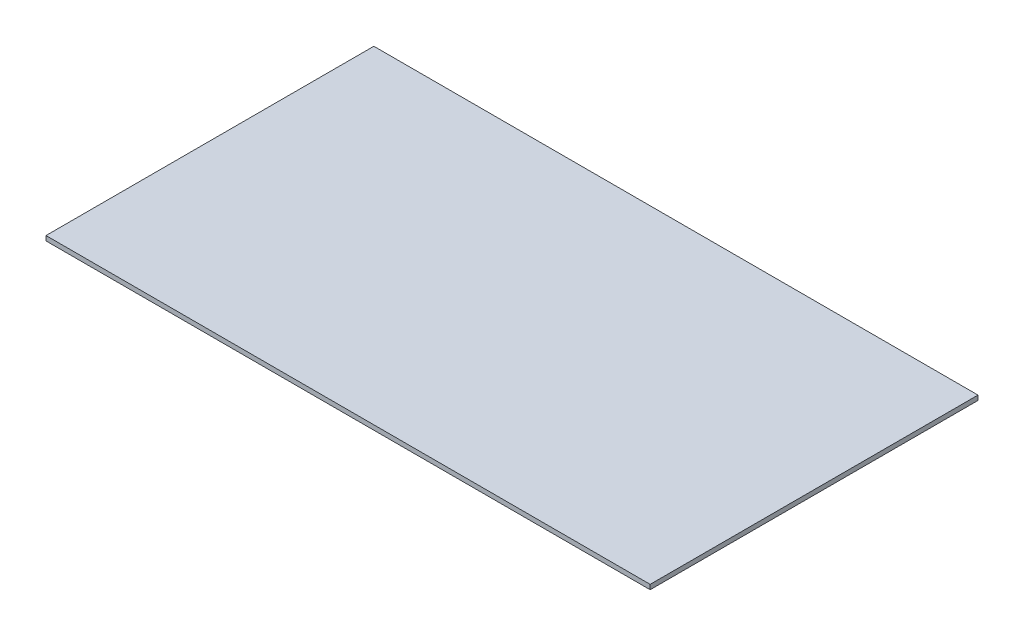
ISO-10303-21;
HEADER;
FILE_DESCRIPTION(('STEP AP214'),'2;1');
FILE_NAME('part.step','',(''),(''),'','','');
FILE_SCHEMA(('AUTOMOTIVE_DESIGN { 1 0 10303 214 1 1 1 1 }'));
ENDSEC;
DATA;
#1=APPLICATION_CONTEXT('core data for automotive mechanical design processes');
#2=APPLICATION_PROTOCOL_DEFINITION('international standard','automotive_design',2000,#1);
#3=PRODUCT_CONTEXT('',#1,'mechanical');
#4=PRODUCT('Part','Part','',(#3));
#5=PRODUCT_RELATED_PRODUCT_CATEGORY('part','',(#4));
#6=PRODUCT_DEFINITION_FORMATION('','',#4);
#7=PRODUCT_DEFINITION_CONTEXT('part definition',#1,'design');
#8=PRODUCT_DEFINITION('design','',#6,#7);
#9=PRODUCT_DEFINITION_SHAPE('','',#8);
#10=(LENGTH_UNIT() NAMED_UNIT(*) SI_UNIT(.MILLI.,.METRE.));
#11=(NAMED_UNIT(*) PLANE_ANGLE_UNIT() SI_UNIT($,.RADIAN.));
#12=(NAMED_UNIT(*) SI_UNIT($,.STERADIAN.) SOLID_ANGLE_UNIT());
#13=UNCERTAINTY_MEASURE_WITH_UNIT(LENGTH_MEASURE(1.E-05),#10,'distance_accuracy_value','');
#14=(GEOMETRIC_REPRESENTATION_CONTEXT(3) GLOBAL_UNCERTAINTY_ASSIGNED_CONTEXT((#13)) GLOBAL_UNIT_ASSIGNED_CONTEXT((#10,
#11,#12)) REPRESENTATION_CONTEXT('',''));
#15=CARTESIAN_POINT('',(0.,0.,0.));
#16=DIRECTION('',(0.,0.,1.));
#17=DIRECTION('',(1.,0.,0.));
#18=AXIS2_PLACEMENT_3D('',#15,#16,#17);
#19=CARTESIAN_POINT('',(-322.5,-59.9999999999972,995.019379553824));
#20=DIRECTION('',(1.,0.,0.));
#21=DIRECTION('',(0.,0.,-1.));
#22=AXIS2_PLACEMENT_3D('',#19,#20,#21);
#23=PLANE('',#22);
#24=DIRECTION('',(0.,-1.,0.));
#25=VECTOR('',#24,1.);
#26=CARTESIAN_POINT('',(-322.5,-59.9999999999972,350.));
#27=LINE('',#26,#25);
#28=CARTESIAN_POINT('',(-322.5,-55.0000000000011,350.));
#29=VERTEX_POINT('',#28);
#30=CARTESIAN_POINT('',(-322.5,-60.0000000000011,350.));
#31=VERTEX_POINT('',#30);
#32=EDGE_CURVE('E102',#29,#31,#27,.T.);
#33=ORIENTED_EDGE('',*,*,#32,.F.);
#34=DIRECTION('',(0.,0.,-1.));
#35=VECTOR('',#34,1.);
#36=CARTESIAN_POINT('',(-322.5,-54.9999999999983,995.019379553824));
#37=LINE('',#36,#35);
#38=CARTESIAN_POINT('',(-322.5,-54.9999999999983,0.));
#39=VERTEX_POINT('',#38);
#40=EDGE_CURVE('E93',#29,#39,#37,.T.);
#41=ORIENTED_EDGE('',*,*,#40,.T.);
#42=DIRECTION('',(0.,-1.,0.));
#43=VECTOR('',#42,1.);
#44=CARTESIAN_POINT('',(-322.5,-59.9999999999972,0.));
#45=LINE('',#44,#43);
#46=CARTESIAN_POINT('',(-322.5,-59.9999999999972,0.));
#47=VERTEX_POINT('',#46);
#48=EDGE_CURVE('E84',#39,#47,#45,.T.);
#49=ORIENTED_EDGE('',*,*,#48,.T.);
#50=DIRECTION('',(0.,0.,-1.));
#51=VECTOR('',#50,1.);
#52=CARTESIAN_POINT('',(-322.5,-59.9999999999972,995.019379553824));
#53=LINE('',#52,#51);
#54=EDGE_CURVE('E75',#31,#47,#53,.T.);
#55=ORIENTED_EDGE('',*,*,#54,.F.);
#56=EDGE_LOOP('',(#33,#41,#49,#55));
#57=FACE_BOUND('',#56,.T.);
#58=ADVANCED_FACE('F34',(#57),#23,.F.);
#59=CARTESIAN_POINT('',(-322.5,-59.9999999999972,995.019379553824));
#60=DIRECTION('',(0.,1.,0.));
#61=DIRECTION('',(0.,0.,1.));
#62=AXIS2_PLACEMENT_3D('',#59,#60,#61);
#63=PLANE('',#62);
#64=DIRECTION('',(1.,0.,0.));
#65=VECTOR('',#64,1.);
#66=CARTESIAN_POINT('',(-322.5,-59.9999999999972,350.));
#67=LINE('',#66,#65);
#68=CARTESIAN_POINT('',(322.5,-60.0000000000011,350.));
#69=VERTEX_POINT('',#68);
#70=EDGE_CURVE('E81',#31,#69,#67,.T.);
#71=ORIENTED_EDGE('',*,*,#70,.F.);
#72=ORIENTED_EDGE('',*,*,#54,.T.);
#73=DIRECTION('',(1.,0.,0.));
#74=VECTOR('',#73,1.);
#75=CARTESIAN_POINT('',(-322.5,-59.9999999999972,0.));
#76=LINE('',#75,#74);
#77=CARTESIAN_POINT('',(322.5,-59.9999999999972,0.));
#78=VERTEX_POINT('',#77);
#79=EDGE_CURVE('E78',#47,#78,#76,.T.);
#80=ORIENTED_EDGE('',*,*,#79,.T.);
#81=DIRECTION('',(0.,0.,-1.));
#82=VECTOR('',#81,1.);
#83=CARTESIAN_POINT('',(322.5,-59.9999999999972,995.019379553824));
#84=LINE('',#83,#82);
#85=EDGE_CURVE('E69',#69,#78,#84,.T.);
#86=ORIENTED_EDGE('',*,*,#85,.F.);
#87=EDGE_LOOP('',(#71,#72,#80,#86));
#88=FACE_BOUND('',#87,.T.);
#89=ADVANCED_FACE('F77',(#88),#63,.F.);
#90=CARTESIAN_POINT('',(322.5,-59.9999999999972,995.019379553824));
#91=DIRECTION('',(-1.,0.,0.));
#92=DIRECTION('',(0.,0.,1.));
#93=AXIS2_PLACEMENT_3D('',#90,#91,#92);
#94=PLANE('',#93);
#95=DIRECTION('',(0.,1.,0.));
#96=VECTOR('',#95,1.);
#97=CARTESIAN_POINT('',(322.5,-59.9999999999972,350.));
#98=LINE('',#97,#96);
#99=CARTESIAN_POINT('',(322.5,-54.9999999999983,350.));
#100=VERTEX_POINT('',#99);
#101=EDGE_CURVE('E38',#69,#100,#98,.T.);
#102=ORIENTED_EDGE('',*,*,#101,.F.);
#103=ORIENTED_EDGE('',*,*,#85,.T.);
#104=DIRECTION('',(0.,1.,0.));
#105=VECTOR('',#104,1.);
#106=CARTESIAN_POINT('',(322.5,-59.9999999999972,0.));
#107=LINE('',#106,#105);
#108=CARTESIAN_POINT('',(322.5,-54.9999999999983,0.));
#109=VERTEX_POINT('',#108);
#110=EDGE_CURVE('E90',#78,#109,#107,.T.);
#111=ORIENTED_EDGE('',*,*,#110,.T.);
#112=DIRECTION('',(0.,0.,-1.));
#113=VECTOR('',#112,1.);
#114=CARTESIAN_POINT('',(322.5,-54.9999999999983,995.019379553824));
#115=LINE('',#114,#113);
#116=EDGE_CURVE('E100',#100,#109,#115,.T.);
#117=ORIENTED_EDGE('',*,*,#116,.F.);
#118=EDGE_LOOP('',(#102,#103,#111,#117));
#119=FACE_BOUND('',#118,.T.);
#120=ADVANCED_FACE('F107',(#119),#94,.F.);
#121=CARTESIAN_POINT('',(-322.5,-54.9999999999983,995.019379553824));
#122=DIRECTION('',(0.,-1.,0.));
#123=DIRECTION('',(0.,0.,-1.));
#124=AXIS2_PLACEMENT_3D('',#121,#122,#123);
#125=PLANE('',#124);
#126=DIRECTION('',(-1.,0.,0.));
#127=VECTOR('',#126,1.);
#128=CARTESIAN_POINT('',(-322.5,-54.9999999999983,350.));
#129=LINE('',#128,#127);
#130=EDGE_CURVE('E11',#100,#29,#129,.T.);
#131=ORIENTED_EDGE('',*,*,#130,.F.);
#132=ORIENTED_EDGE('',*,*,#116,.T.);
#133=DIRECTION('',(-1.,0.,0.));
#134=VECTOR('',#133,1.);
#135=CARTESIAN_POINT('',(-322.5,-54.9999999999983,0.));
#136=LINE('',#135,#134);
#137=EDGE_CURVE('E101',#109,#39,#136,.T.);
#138=ORIENTED_EDGE('',*,*,#137,.T.);
#139=ORIENTED_EDGE('',*,*,#40,.F.);
#140=EDGE_LOOP('',(#131,#132,#138,#139));
#141=FACE_BOUND('',#140,.T.);
#142=ADVANCED_FACE('F108',(#141),#125,.F.);
#143=CARTESIAN_POINT('',(-322.5,-54.9999999999983,0.));
#144=DIRECTION('',(0.,0.,-1.));
#145=DIRECTION('',(-1.,0.,0.));
#146=AXIS2_PLACEMENT_3D('',#143,#144,#145);
#147=PLANE('',#146);
#148=ORIENTED_EDGE('',*,*,#48,.F.);
#149=ORIENTED_EDGE('',*,*,#137,.F.);
#150=ORIENTED_EDGE('',*,*,#110,.F.);
#151=ORIENTED_EDGE('',*,*,#79,.F.);
#152=EDGE_LOOP('',(#148,#149,#150,#151));
#153=FACE_BOUND('',#152,.T.);
#154=ADVANCED_FACE('F88',(#153),#147,.T.);
#155=CARTESIAN_POINT('',(-332.5,-60.0000000000011,350.));
#156=DIRECTION('',(0.,0.,1.));
#157=DIRECTION('',(1.,0.,0.));
#158=AXIS2_PLACEMENT_3D('',#155,#156,#157);
#159=PLANE('',#158);
#160=ORIENTED_EDGE('',*,*,#32,.T.);
#161=ORIENTED_EDGE('',*,*,#70,.T.);
#162=ORIENTED_EDGE('',*,*,#101,.T.);
#163=ORIENTED_EDGE('',*,*,#130,.T.);
#164=EDGE_LOOP('',(#160,#161,#162,#163));
#165=FACE_BOUND('',#164,.T.);
#166=ADVANCED_FACE('F36',(#165),#159,.T.);
#167=CLOSED_SHELL('',(#58,#89,#120,#142,#154,#166));
#168=MANIFOLD_SOLID_BREP('B2',#167);
#169=ADVANCED_BREP_SHAPE_REPRESENTATION('',(#18,#168),#14);
#170=SHAPE_DEFINITION_REPRESENTATION(#9,#169);
ENDSEC;
END-ISO-10303-21;
